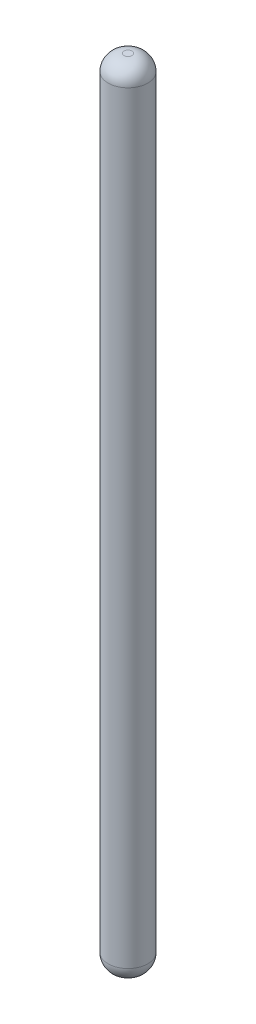
ISO-10303-21;
HEADER;
FILE_DESCRIPTION(('STEP AP214'),'2;1');
FILE_NAME('part.step','',(''),(''),'','','');
FILE_SCHEMA(('AUTOMOTIVE_DESIGN { 1 0 10303 214 1 1 1 1 }'));
ENDSEC;
DATA;
#1=APPLICATION_CONTEXT('core data for automotive mechanical design processes');
#2=APPLICATION_PROTOCOL_DEFINITION('international standard','automotive_design',2000,#1);
#3=PRODUCT_CONTEXT('',#1,'mechanical');
#4=PRODUCT('Part','Part','',(#3));
#5=PRODUCT_RELATED_PRODUCT_CATEGORY('part','',(#4));
#6=PRODUCT_DEFINITION_FORMATION('','',#4);
#7=PRODUCT_DEFINITION_CONTEXT('part definition',#1,'design');
#8=PRODUCT_DEFINITION('design','',#6,#7);
#9=PRODUCT_DEFINITION_SHAPE('','',#8);
#10=(LENGTH_UNIT() NAMED_UNIT(*) SI_UNIT(.MILLI.,.METRE.));
#11=(NAMED_UNIT(*) PLANE_ANGLE_UNIT() SI_UNIT($,.RADIAN.));
#12=(NAMED_UNIT(*) SI_UNIT($,.STERADIAN.) SOLID_ANGLE_UNIT());
#13=UNCERTAINTY_MEASURE_WITH_UNIT(LENGTH_MEASURE(1.E-05),#10,'distance_accuracy_value','');
#14=(GEOMETRIC_REPRESENTATION_CONTEXT(3) GLOBAL_UNCERTAINTY_ASSIGNED_CONTEXT((#13)) GLOBAL_UNIT_ASSIGNED_CONTEXT((#10,
#11,#12)) REPRESENTATION_CONTEXT('',''));
#15=CARTESIAN_POINT('',(0.,0.,0.));
#16=DIRECTION('',(0.,0.,1.));
#17=DIRECTION('',(1.,0.,0.));
#18=AXIS2_PLACEMENT_3D('',#15,#16,#17);
#19=CARTESIAN_POINT('',(0.,1000.,0.));
#20=DIRECTION('',(0.,-1.,0.));
#21=DIRECTION('',(0.,0.,-1.));
#22=AXIS2_PLACEMENT_3D('',#19,#20,#21);
#23=CYLINDRICAL_SURFACE('',#22,50.);
#24=CARTESIAN_POINT('',(0.,960.,0.));
#25=DIRECTION('',(0.,1.,0.));
#26=DIRECTION('',(0.,0.,1.));
#27=AXIS2_PLACEMENT_3D('',#24,#25,#26);
#28=CIRCLE('',#27,50.);
#29=CARTESIAN_POINT('',(0.,960.,50.));
#30=VERTEX_POINT('',#29);
#31=EDGE_CURVE('E38',#30,#30,#28,.F.);
#32=ORIENTED_EDGE('',*,*,#31,.T.);
#33=EDGE_LOOP('',(#32));
#34=FACE_BOUND('',#33,.T.);
#35=CARTESIAN_POINT('',(0.,-960.,0.));
#36=DIRECTION('',(0.,1.,0.));
#37=DIRECTION('',(0.,0.,1.));
#38=AXIS2_PLACEMENT_3D('',#35,#36,#37);
#39=CIRCLE('',#38,50.);
#40=CARTESIAN_POINT('',(0.,-960.,50.));
#41=VERTEX_POINT('',#40);
#42=EDGE_CURVE('E42',#41,#41,#39,.T.);
#43=ORIENTED_EDGE('',*,*,#42,.T.);
#44=EDGE_LOOP('',(#43));
#45=FACE_BOUND('',#44,.T.);
#46=ADVANCED_FACE('F31',(#34,#45),#23,.T.);
#47=CARTESIAN_POINT('',(0.,1000.,0.));
#48=DIRECTION('',(0.,1.,0.));
#49=DIRECTION('',(0.,0.,1.));
#50=AXIS2_PLACEMENT_3D('',#47,#48,#49);
#51=PLANE('',#50);
#52=CARTESIAN_POINT('',(0.,1000.,0.));
#53=DIRECTION('',(0.,1.,0.));
#54=DIRECTION('',(0.,0.,1.));
#55=AXIS2_PLACEMENT_3D('',#52,#53,#54);
#56=CIRCLE('',#55,10.);
#57=CARTESIAN_POINT('',(0.,1000.,10.));
#58=VERTEX_POINT('',#57);
#59=EDGE_CURVE('E46',#58,#58,#56,.T.);
#60=ORIENTED_EDGE('',*,*,#59,.T.);
#61=EDGE_LOOP('',(#60));
#62=FACE_BOUND('',#61,.T.);
#63=ADVANCED_FACE('F52',(#62),#51,.T.);
#64=CARTESIAN_POINT('',(0.,-1000.,0.));
#65=DIRECTION('',(0.,1.,0.));
#66=DIRECTION('',(0.,0.,1.));
#67=AXIS2_PLACEMENT_3D('',#64,#65,#66);
#68=PLANE('',#67);
#69=CARTESIAN_POINT('',(0.,-1000.,0.));
#70=DIRECTION('',(0.,1.,0.));
#71=DIRECTION('',(0.,0.,1.));
#72=AXIS2_PLACEMENT_3D('',#69,#70,#71);
#73=CIRCLE('',#72,10.);
#74=CARTESIAN_POINT('',(0.,-1000.,10.));
#75=VERTEX_POINT('',#74);
#76=EDGE_CURVE('E10',#75,#75,#73,.F.);
#77=ORIENTED_EDGE('',*,*,#76,.T.);
#78=EDGE_LOOP('',(#77));
#79=FACE_BOUND('',#78,.T.);
#80=ADVANCED_FACE('F56',(#79),#68,.F.);
#81=CARTESIAN_POINT('',(0.,960.,0.));
#82=DIRECTION('',(0.,1.,0.));
#83=DIRECTION('',(0.,0.,1.));
#84=AXIS2_PLACEMENT_3D('',#81,#82,#83);
#85=DEGENERATE_TOROIDAL_SURFACE('',#84,10.,40.,.T.);
#86=ORIENTED_EDGE('',*,*,#31,.F.);
#87=EDGE_LOOP('',(#86));
#88=FACE_BOUND('',#87,.T.);
#89=ORIENTED_EDGE('',*,*,#59,.F.);
#90=EDGE_LOOP('',(#89));
#91=FACE_BOUND('',#90,.T.);
#92=ADVANCED_FACE('F54',(#88,#91),#85,.T.);
#93=CARTESIAN_POINT('',(0.,-960.,0.));
#94=DIRECTION('',(0.,1.,0.));
#95=DIRECTION('',(0.,0.,1.));
#96=AXIS2_PLACEMENT_3D('',#93,#94,#95);
#97=DEGENERATE_TOROIDAL_SURFACE('',#96,10.,40.,.T.);
#98=ORIENTED_EDGE('',*,*,#76,.F.);
#99=EDGE_LOOP('',(#98));
#100=FACE_BOUND('',#99,.T.);
#101=ORIENTED_EDGE('',*,*,#42,.F.);
#102=EDGE_LOOP('',(#101));
#103=FACE_BOUND('',#102,.T.);
#104=ADVANCED_FACE('F33',(#100,#103),#97,.T.);
#105=CLOSED_SHELL('',(#46,#63,#80,#92,#104));
#106=MANIFOLD_SOLID_BREP('B2',#105);
#107=ADVANCED_BREP_SHAPE_REPRESENTATION('',(#18,#106),#14);
#108=SHAPE_DEFINITION_REPRESENTATION(#9,#107);
ENDSEC;
END-ISO-10303-21;
